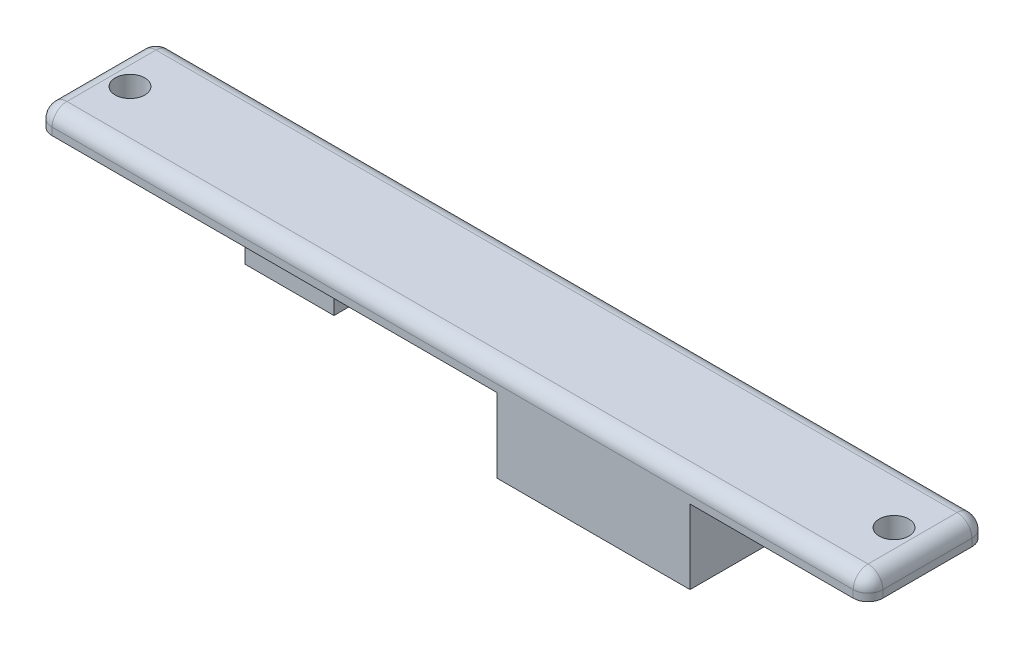
ISO-10303-21;
HEADER;
FILE_DESCRIPTION(('STEP AP214'),'2;1');
FILE_NAME('part.step','',(''),(''),'','','');
FILE_SCHEMA(('AUTOMOTIVE_DESIGN { 1 0 10303 214 1 1 1 1 }'));
ENDSEC;
DATA;
#1=APPLICATION_CONTEXT('core data for automotive mechanical design processes');
#2=APPLICATION_PROTOCOL_DEFINITION('international standard','automotive_design',2000,#1);
#3=PRODUCT_CONTEXT('',#1,'mechanical');
#4=PRODUCT('Part','Part','',(#3));
#5=PRODUCT_RELATED_PRODUCT_CATEGORY('part','',(#4));
#6=PRODUCT_DEFINITION_FORMATION('','',#4);
#7=PRODUCT_DEFINITION_CONTEXT('part definition',#1,'design');
#8=PRODUCT_DEFINITION('design','',#6,#7);
#9=PRODUCT_DEFINITION_SHAPE('','',#8);
#10=(LENGTH_UNIT() NAMED_UNIT(*) SI_UNIT(.MILLI.,.METRE.));
#11=(NAMED_UNIT(*) PLANE_ANGLE_UNIT() SI_UNIT($,.RADIAN.));
#12=(NAMED_UNIT(*) SI_UNIT($,.STERADIAN.) SOLID_ANGLE_UNIT());
#13=UNCERTAINTY_MEASURE_WITH_UNIT(LENGTH_MEASURE(1.E-05),#10,'distance_accuracy_value','');
#14=(GEOMETRIC_REPRESENTATION_CONTEXT(3) GLOBAL_UNCERTAINTY_ASSIGNED_CONTEXT((#13)) GLOBAL_UNIT_ASSIGNED_CONTEXT((#10,
#11,#12)) REPRESENTATION_CONTEXT('',''));
#15=CARTESIAN_POINT('',(0.,0.,0.));
#16=DIRECTION('',(0.,0.,1.));
#17=DIRECTION('',(1.,0.,0.));
#18=AXIS2_PLACEMENT_3D('',#15,#16,#17);
#19=CARTESIAN_POINT('',(0.,0.,0.));
#20=DIRECTION('',(0.,1.,0.));
#21=DIRECTION('',(0.,0.,1.));
#22=AXIS2_PLACEMENT_3D('',#19,#20,#21);
#23=PLANE('',#22);
#24=CARTESIAN_POINT('',(-25.75,0.,0.));
#25=DIRECTION('',(0.,1.,0.));
#26=DIRECTION('',(0.,0.,1.));
#27=AXIS2_PLACEMENT_3D('',#24,#25,#26);
#28=CIRCLE('',#27,1.);
#29=CARTESIAN_POINT('',(-25.75,0.,1.));
#30=VERTEX_POINT('',#29);
#31=EDGE_CURVE('E213',#30,#30,#28,.T.);
#32=ORIENTED_EDGE('',*,*,#31,.T.);
#33=EDGE_LOOP('',(#32));
#34=FACE_BOUND('',#33,.T.);
#35=DIRECTION('',(0.,0.,-1.));
#36=VECTOR('',#35,1.);
#37=CARTESIAN_POINT('',(-18.,0.,-4.));
#38=LINE('',#37,#36);
#39=CARTESIAN_POINT('',(-18.,0.,0.));
#40=VERTEX_POINT('',#39);
#41=CARTESIAN_POINT('',(-18.,0.,-4.));
#42=VERTEX_POINT('',#41);
#43=EDGE_CURVE('E50',#40,#42,#38,.T.);
#44=ORIENTED_EDGE('',*,*,#43,.F.);
#45=DIRECTION('',(-1.,0.,0.));
#46=VECTOR('',#45,1.);
#47=CARTESIAN_POINT('',(-18.,0.,0.));
#48=LINE('',#47,#46);
#49=CARTESIAN_POINT('',(-12.,0.,0.));
#50=VERTEX_POINT('',#49);
#51=EDGE_CURVE('E54',#50,#40,#48,.T.);
#52=ORIENTED_EDGE('',*,*,#51,.F.);
#53=DIRECTION('',(0.,0.,1.));
#54=VECTOR('',#53,1.);
#55=CARTESIAN_POINT('',(-12.,0.,-4.));
#56=LINE('',#55,#54);
#57=CARTESIAN_POINT('',(-12.,0.,-4.));
#58=VERTEX_POINT('',#57);
#59=EDGE_CURVE('E630',#58,#50,#56,.T.);
#60=ORIENTED_EDGE('',*,*,#59,.F.);
#61=DIRECTION('',(1.,0.,0.));
#62=VECTOR('',#61,1.);
#63=CARTESIAN_POINT('',(-28.,0.,-4.));
#64=LINE('',#63,#62);
#65=CARTESIAN_POINT('',(3.,0.,-4.));
#66=VERTEX_POINT('',#65);
#67=EDGE_CURVE('E239',#58,#66,#64,.T.);
#68=ORIENTED_EDGE('',*,*,#67,.T.);
#69=DIRECTION('',(0.,0.,-1.));
#70=VECTOR('',#69,1.);
#71=CARTESIAN_POINT('',(3.,0.,4.));
#72=LINE('',#71,#70);
#73=CARTESIAN_POINT('',(3.,0.,4.));
#74=VERTEX_POINT('',#73);
#75=EDGE_CURVE('E180',#74,#66,#72,.T.);
#76=ORIENTED_EDGE('',*,*,#75,.F.);
#77=DIRECTION('',(1.,0.,0.));
#78=VECTOR('',#77,1.);
#79=CARTESIAN_POINT('',(-28.,0.,4.));
#80=LINE('',#79,#78);
#81=CARTESIAN_POINT('',(-27.,0.,4.));
#82=VERTEX_POINT('',#81);
#83=EDGE_CURVE('E229',#82,#74,#80,.T.);
#84=ORIENTED_EDGE('',*,*,#83,.F.);
#85=CARTESIAN_POINT('',(-27.,0.,3.));
#86=DIRECTION('',(0.,1.,0.));
#87=DIRECTION('',(0.,0.,1.));
#88=AXIS2_PLACEMENT_3D('',#85,#86,#87);
#89=CIRCLE('',#88,1.);
#90=CARTESIAN_POINT('',(-28.,0.,3.));
#91=VERTEX_POINT('',#90);
#92=EDGE_CURVE('E276',#82,#91,#89,.F.);
#93=ORIENTED_EDGE('',*,*,#92,.T.);
#94=DIRECTION('',(0.,0.,1.));
#95=VECTOR('',#94,1.);
#96=CARTESIAN_POINT('',(-28.,0.,-4.));
#97=LINE('',#96,#95);
#98=CARTESIAN_POINT('',(-28.,0.,-3.));
#99=VERTEX_POINT('',#98);
#100=EDGE_CURVE('E225',#99,#91,#97,.T.);
#101=ORIENTED_EDGE('',*,*,#100,.F.);
#102=CARTESIAN_POINT('',(-27.,0.,-3.));
#103=DIRECTION('',(0.,1.,0.));
#104=DIRECTION('',(0.,0.,1.));
#105=AXIS2_PLACEMENT_3D('',#102,#103,#104);
#106=CIRCLE('',#105,1.);
#107=CARTESIAN_POINT('',(-27.,0.,-4.));
#108=VERTEX_POINT('',#107);
#109=EDGE_CURVE('E274',#99,#108,#106,.F.);
#110=ORIENTED_EDGE('',*,*,#109,.T.);
#111=EDGE_CURVE('E236',#108,#42,#64,.T.);
#112=ORIENTED_EDGE('',*,*,#111,.T.);
#113=EDGE_LOOP('',(#44,#52,#60,#68,#76,#84,#93,#101,#110,#112));
#114=FACE_BOUND('',#113,.T.);
#115=ADVANCED_FACE('F33',(#34,#114),#23,.F.);
#116=CARTESIAN_POINT('',(25.75,0.,0.));
#117=DIRECTION('',(0.,1.,0.));
#118=DIRECTION('',(0.,0.,1.));
#119=AXIS2_PLACEMENT_3D('',#116,#117,#118);
#120=CIRCLE('',#119,1.);
#121=CARTESIAN_POINT('',(25.75,0.,1.));
#122=VERTEX_POINT('',#121);
#123=EDGE_CURVE('E217',#122,#122,#120,.T.);
#124=ORIENTED_EDGE('',*,*,#123,.T.);
#125=EDGE_LOOP('',(#124));
#126=FACE_BOUND('',#125,.T.);
#127=DIRECTION('',(0.,0.,1.));
#128=VECTOR('',#127,1.);
#129=CARTESIAN_POINT('',(16.,0.,4.));
#130=LINE('',#129,#128);
#131=CARTESIAN_POINT('',(16.,0.,-4.));
#132=VERTEX_POINT('',#131);
#133=CARTESIAN_POINT('',(16.,0.,4.));
#134=VERTEX_POINT('',#133);
#135=EDGE_CURVE('E183',#132,#134,#130,.T.);
#136=ORIENTED_EDGE('',*,*,#135,.F.);
#137=CARTESIAN_POINT('',(27.,0.,-4.));
#138=VERTEX_POINT('',#137);
#139=EDGE_CURVE('E235',#132,#138,#64,.T.);
#140=ORIENTED_EDGE('',*,*,#139,.T.);
#141=CARTESIAN_POINT('',(27.,0.,-3.));
#142=DIRECTION('',(0.,1.,0.));
#143=DIRECTION('',(0.,0.,1.));
#144=AXIS2_PLACEMENT_3D('',#141,#142,#143);
#145=CIRCLE('',#144,1.);
#146=CARTESIAN_POINT('',(28.,0.,-3.));
#147=VERTEX_POINT('',#146);
#148=EDGE_CURVE('E11',#138,#147,#145,.F.);
#149=ORIENTED_EDGE('',*,*,#148,.T.);
#150=DIRECTION('',(0.,0.,1.));
#151=VECTOR('',#150,1.);
#152=CARTESIAN_POINT('',(28.,0.,-4.));
#153=LINE('',#152,#151);
#154=CARTESIAN_POINT('',(28.,0.,3.));
#155=VERTEX_POINT('',#154);
#156=EDGE_CURVE('E232',#147,#155,#153,.T.);
#157=ORIENTED_EDGE('',*,*,#156,.T.);
#158=CARTESIAN_POINT('',(27.,0.,3.));
#159=DIRECTION('',(0.,1.,0.));
#160=DIRECTION('',(0.,0.,1.));
#161=AXIS2_PLACEMENT_3D('',#158,#159,#160);
#162=CIRCLE('',#161,1.);
#163=CARTESIAN_POINT('',(27.,0.,4.));
#164=VERTEX_POINT('',#163);
#165=EDGE_CURVE('E42',#155,#164,#162,.F.);
#166=ORIENTED_EDGE('',*,*,#165,.T.);
#167=EDGE_CURVE('E228',#134,#164,#80,.T.);
#168=ORIENTED_EDGE('',*,*,#167,.F.);
#169=EDGE_LOOP('',(#136,#140,#149,#157,#166,#168));
#170=FACE_BOUND('',#169,.T.);
#171=ADVANCED_FACE('F345',(#126,#170),#23,.F.);
#172=CARTESIAN_POINT('',(-28.,1.5,-4.));
#173=DIRECTION('',(1.,0.,0.));
#174=DIRECTION('',(0.,0.,-1.));
#175=AXIS2_PLACEMENT_3D('',#172,#173,#174);
#176=PLANE('',#175);
#177=ORIENTED_EDGE('',*,*,#100,.T.);
#178=DIRECTION('',(0.,-1.,0.));
#179=VECTOR('',#178,1.);
#180=CARTESIAN_POINT('',(-28.,1.5,3.));
#181=LINE('',#180,#179);
#182=CARTESIAN_POINT('',(-28.,0.5,3.));
#183=VERTEX_POINT('',#182);
#184=EDGE_CURVE('E253',#91,#183,#181,.F.);
#185=ORIENTED_EDGE('',*,*,#184,.T.);
#186=DIRECTION('',(0.,0.,1.));
#187=VECTOR('',#186,1.);
#188=CARTESIAN_POINT('',(-28.,0.5,-4.));
#189=LINE('',#188,#187);
#190=CARTESIAN_POINT('',(-28.,0.5,-3.));
#191=VERTEX_POINT('',#190);
#192=EDGE_CURVE('E250',#183,#191,#189,.F.);
#193=ORIENTED_EDGE('',*,*,#192,.T.);
#194=DIRECTION('',(0.,-1.,0.));
#195=VECTOR('',#194,1.);
#196=CARTESIAN_POINT('',(-28.,0.,-3.));
#197=LINE('',#196,#195);
#198=EDGE_CURVE('E248',#191,#99,#197,.T.);
#199=ORIENTED_EDGE('',*,*,#198,.T.);
#200=EDGE_LOOP('',(#177,#185,#193,#199));
#201=FACE_BOUND('',#200,.T.);
#202=ADVANCED_FACE('F384',(#201),#176,.F.);
#203=CARTESIAN_POINT('',(-28.,1.5,4.));
#204=DIRECTION('',(0.,0.,-1.));
#205=DIRECTION('',(-1.,0.,0.));
#206=AXIS2_PLACEMENT_3D('',#203,#204,#205);
#207=PLANE('',#206);
#208=ORIENTED_EDGE('',*,*,#83,.T.);
#209=DIRECTION('',(0.,1.,0.));
#210=VECTOR('',#209,1.);
#211=CARTESIAN_POINT('',(3.,-5.,4.));
#212=LINE('',#211,#210);
#213=CARTESIAN_POINT('',(3.,-5.,4.));
#214=VERTEX_POINT('',#213);
#215=EDGE_CURVE('E197',#214,#74,#212,.T.);
#216=ORIENTED_EDGE('',*,*,#215,.F.);
#217=DIRECTION('',(-1.,0.,0.));
#218=VECTOR('',#217,1.);
#219=CARTESIAN_POINT('',(3.,-5.,4.));
#220=LINE('',#219,#218);
#221=CARTESIAN_POINT('',(16.,-5.,4.));
#222=VERTEX_POINT('',#221);
#223=EDGE_CURVE('E196',#222,#214,#220,.T.);
#224=ORIENTED_EDGE('',*,*,#223,.F.);
#225=DIRECTION('',(0.,1.,0.));
#226=VECTOR('',#225,1.);
#227=CARTESIAN_POINT('',(16.,-5.,4.));
#228=LINE('',#227,#226);
#229=EDGE_CURVE('E203',#222,#134,#228,.T.);
#230=ORIENTED_EDGE('',*,*,#229,.T.);
#231=ORIENTED_EDGE('',*,*,#167,.T.);
#232=DIRECTION('',(0.,-1.,0.));
#233=VECTOR('',#232,1.);
#234=CARTESIAN_POINT('',(27.,1.5,4.));
#235=LINE('',#234,#233);
#236=CARTESIAN_POINT('',(27.,0.5,4.));
#237=VERTEX_POINT('',#236);
#238=EDGE_CURVE('E272',#164,#237,#235,.F.);
#239=ORIENTED_EDGE('',*,*,#238,.T.);
#240=DIRECTION('',(1.,0.,0.));
#241=VECTOR('',#240,1.);
#242=CARTESIAN_POINT('',(-28.,0.5,4.));
#243=LINE('',#242,#241);
#244=CARTESIAN_POINT('',(-27.,0.5,4.));
#245=VERTEX_POINT('',#244);
#246=EDGE_CURVE('E270',#237,#245,#243,.F.);
#247=ORIENTED_EDGE('',*,*,#246,.T.);
#248=DIRECTION('',(0.,-1.,0.));
#249=VECTOR('',#248,1.);
#250=CARTESIAN_POINT('',(-27.,1.5,4.));
#251=LINE('',#250,#249);
#252=EDGE_CURVE('E268',#245,#82,#251,.T.);
#253=ORIENTED_EDGE('',*,*,#252,.T.);
#254=EDGE_LOOP('',(#208,#216,#224,#230,#231,#239,#247,#253));
#255=FACE_BOUND('',#254,.T.);
#256=ADVANCED_FACE('F393',(#255),#207,.F.);
#257=CARTESIAN_POINT('',(28.,1.5,-4.));
#258=DIRECTION('',(1.,0.,0.));
#259=DIRECTION('',(0.,0.,-1.));
#260=AXIS2_PLACEMENT_3D('',#257,#258,#259);
#261=PLANE('',#260);
#262=ORIENTED_EDGE('',*,*,#156,.F.);
#263=DIRECTION('',(0.,-1.,0.));
#264=VECTOR('',#263,1.);
#265=CARTESIAN_POINT('',(28.,1.5,-3.));
#266=LINE('',#265,#264);
#267=CARTESIAN_POINT('',(28.,0.5,-3.));
#268=VERTEX_POINT('',#267);
#269=EDGE_CURVE('E266',#147,#268,#266,.F.);
#270=ORIENTED_EDGE('',*,*,#269,.T.);
#271=DIRECTION('',(0.,0.,1.));
#272=VECTOR('',#271,1.);
#273=CARTESIAN_POINT('',(28.,0.5,-4.));
#274=LINE('',#273,#272);
#275=CARTESIAN_POINT('',(28.,0.5,3.));
#276=VERTEX_POINT('',#275);
#277=EDGE_CURVE('E264',#268,#276,#274,.T.);
#278=ORIENTED_EDGE('',*,*,#277,.T.);
#279=DIRECTION('',(0.,-1.,0.));
#280=VECTOR('',#279,1.);
#281=CARTESIAN_POINT('',(28.,0.,3.));
#282=LINE('',#281,#280);
#283=EDGE_CURVE('E262',#276,#155,#282,.T.);
#284=ORIENTED_EDGE('',*,*,#283,.T.);
#285=EDGE_LOOP('',(#262,#270,#278,#284));
#286=FACE_BOUND('',#285,.T.);
#287=ADVANCED_FACE('F337',(#286),#261,.T.);
#288=CARTESIAN_POINT('',(-28.,1.5,-4.));
#289=DIRECTION('',(0.,0.,-1.));
#290=DIRECTION('',(-1.,0.,0.));
#291=AXIS2_PLACEMENT_3D('',#288,#289,#290);
#292=PLANE('',#291);
#293=DIRECTION('',(1.,0.,0.));
#294=VECTOR('',#293,1.);
#295=CARTESIAN_POINT('',(-28.,0.5,-4.));
#296=LINE('',#295,#294);
#297=CARTESIAN_POINT('',(-27.,0.5,-4.));
#298=VERTEX_POINT('',#297);
#299=CARTESIAN_POINT('',(27.,0.5,-4.));
#300=VERTEX_POINT('',#299);
#301=EDGE_CURVE('E257',#298,#300,#296,.T.);
#302=ORIENTED_EDGE('',*,*,#301,.T.);
#303=DIRECTION('',(0.,-1.,0.));
#304=VECTOR('',#303,1.);
#305=CARTESIAN_POINT('',(27.,1.5,-4.));
#306=LINE('',#305,#304);
#307=EDGE_CURVE('E259',#300,#138,#306,.T.);
#308=ORIENTED_EDGE('',*,*,#307,.T.);
#309=ORIENTED_EDGE('',*,*,#139,.F.);
#310=DIRECTION('',(0.,1.,0.));
#311=VECTOR('',#310,1.);
#312=CARTESIAN_POINT('',(16.,-5.,-4.));
#313=LINE('',#312,#311);
#314=CARTESIAN_POINT('',(16.,-5.,-4.));
#315=VERTEX_POINT('',#314);
#316=EDGE_CURVE('E206',#315,#132,#313,.T.);
#317=ORIENTED_EDGE('',*,*,#316,.F.);
#318=DIRECTION('',(1.,0.,0.));
#319=VECTOR('',#318,1.);
#320=CARTESIAN_POINT('',(3.,-5.,-4.));
#321=LINE('',#320,#319);
#322=CARTESIAN_POINT('',(3.,-5.,-4.));
#323=VERTEX_POINT('',#322);
#324=EDGE_CURVE('E192',#323,#315,#321,.T.);
#325=ORIENTED_EDGE('',*,*,#324,.F.);
#326=DIRECTION('',(0.,1.,0.));
#327=VECTOR('',#326,1.);
#328=CARTESIAN_POINT('',(3.,-5.,-4.));
#329=LINE('',#328,#327);
#330=EDGE_CURVE('E209',#323,#66,#329,.T.);
#331=ORIENTED_EDGE('',*,*,#330,.T.);
#332=ORIENTED_EDGE('',*,*,#67,.F.);
#333=DIRECTION('',(0.,1.,0.));
#334=VECTOR('',#333,1.);
#335=CARTESIAN_POINT('',(-12.,-5.,-4.));
#336=LINE('',#335,#334);
#337=CARTESIAN_POINT('',(-12.,-5.,-4.));
#338=VERTEX_POINT('',#337);
#339=EDGE_CURVE('E165',#338,#58,#336,.T.);
#340=ORIENTED_EDGE('',*,*,#339,.F.);
#341=DIRECTION('',(1.,0.,0.));
#342=VECTOR('',#341,1.);
#343=CARTESIAN_POINT('',(-18.,-5.,-4.));
#344=LINE('',#343,#342);
#345=CARTESIAN_POINT('',(-18.,-5.,-4.));
#346=VERTEX_POINT('',#345);
#347=EDGE_CURVE('E158',#346,#338,#344,.T.);
#348=ORIENTED_EDGE('',*,*,#347,.F.);
#349=DIRECTION('',(0.,1.,0.));
#350=VECTOR('',#349,1.);
#351=CARTESIAN_POINT('',(-18.,-5.,-4.));
#352=LINE('',#351,#350);
#353=EDGE_CURVE('E163',#346,#42,#352,.T.);
#354=ORIENTED_EDGE('',*,*,#353,.T.);
#355=ORIENTED_EDGE('',*,*,#111,.F.);
#356=DIRECTION('',(0.,-1.,0.));
#357=VECTOR('',#356,1.);
#358=CARTESIAN_POINT('',(-27.,1.5,-4.));
#359=LINE('',#358,#357);
#360=EDGE_CURVE('E255',#108,#298,#359,.F.);
#361=ORIENTED_EDGE('',*,*,#360,.T.);
#362=EDGE_LOOP('',(#302,#308,#309,#317,#325,#331,#332,#340,#348,#354,#355,#361));
#363=FACE_BOUND('',#362,.T.);
#364=ADVANCED_FACE('F160',(#363),#292,.T.);
#365=CARTESIAN_POINT('',(0.,1.5,0.));
#366=DIRECTION('',(0.,1.,0.));
#367=DIRECTION('',(0.,0.,1.));
#368=AXIS2_PLACEMENT_3D('',#365,#366,#367);
#369=PLANE('',#368);
#370=DIRECTION('',(1.,0.,0.));
#371=VECTOR('',#370,1.);
#372=CARTESIAN_POINT('',(0.,1.5,-3.));
#373=LINE('',#372,#371);
#374=CARTESIAN_POINT('',(27.,1.5,-3.));
#375=VERTEX_POINT('',#374);
#376=CARTESIAN_POINT('',(-27.,1.5,-3.));
#377=VERTEX_POINT('',#376);
#378=EDGE_CURVE('E243',#375,#377,#373,.F.);
#379=ORIENTED_EDGE('',*,*,#378,.T.);
#380=DIRECTION('',(0.,0.,1.));
#381=VECTOR('',#380,1.);
#382=CARTESIAN_POINT('',(-27.,1.5,4.));
#383=LINE('',#382,#381);
#384=CARTESIAN_POINT('',(-27.,1.5,3.));
#385=VERTEX_POINT('',#384);
#386=EDGE_CURVE('E245',#377,#385,#383,.T.);
#387=ORIENTED_EDGE('',*,*,#386,.T.);
#388=DIRECTION('',(1.,0.,0.));
#389=VECTOR('',#388,1.);
#390=CARTESIAN_POINT('',(28.,1.5,3.));
#391=LINE('',#390,#389);
#392=CARTESIAN_POINT('',(27.,1.5,3.));
#393=VERTEX_POINT('',#392);
#394=EDGE_CURVE('E238',#385,#393,#391,.T.);
#395=ORIENTED_EDGE('',*,*,#394,.T.);
#396=DIRECTION('',(0.,0.,1.));
#397=VECTOR('',#396,1.);
#398=CARTESIAN_POINT('',(27.,1.5,0.));
#399=LINE('',#398,#397);
#400=EDGE_CURVE('E241',#393,#375,#399,.F.);
#401=ORIENTED_EDGE('',*,*,#400,.T.);
#402=EDGE_LOOP('',(#379,#387,#395,#401));
#403=FACE_BOUND('',#402,.T.);
#404=CARTESIAN_POINT('',(-25.75,1.5,0.));
#405=DIRECTION('',(0.,1.,0.));
#406=DIRECTION('',(0.,0.,1.));
#407=AXIS2_PLACEMENT_3D('',#404,#405,#406);
#408=CIRCLE('',#407,1.);
#409=CARTESIAN_POINT('',(-25.75,1.5,1.));
#410=VERTEX_POINT('',#409);
#411=EDGE_CURVE('E222',#410,#410,#408,.T.);
#412=ORIENTED_EDGE('',*,*,#411,.F.);
#413=EDGE_LOOP('',(#412));
#414=FACE_BOUND('',#413,.T.);
#415=CARTESIAN_POINT('',(25.75,1.5,0.));
#416=DIRECTION('',(0.,1.,0.));
#417=DIRECTION('',(0.,0.,1.));
#418=AXIS2_PLACEMENT_3D('',#415,#416,#417);
#419=CIRCLE('',#418,1.);
#420=CARTESIAN_POINT('',(25.75,1.5,1.));
#421=VERTEX_POINT('',#420);
#422=EDGE_CURVE('E216',#421,#421,#419,.T.);
#423=ORIENTED_EDGE('',*,*,#422,.F.);
#424=EDGE_LOOP('',(#423));
#425=FACE_BOUND('',#424,.T.);
#426=ADVANCED_FACE('F325',(#403,#414,#425),#369,.T.);
#427=CARTESIAN_POINT('',(25.75,0.,0.));
#428=DIRECTION('',(0.,1.,0.));
#429=DIRECTION('',(0.,0.,1.));
#430=AXIS2_PLACEMENT_3D('',#427,#428,#429);
#431=CYLINDRICAL_SURFACE('',#430,1.);
#432=ORIENTED_EDGE('',*,*,#422,.T.);
#433=EDGE_LOOP('',(#432));
#434=FACE_BOUND('',#433,.T.);
#435=ORIENTED_EDGE('',*,*,#123,.F.);
#436=EDGE_LOOP('',(#435));
#437=FACE_BOUND('',#436,.T.);
#438=ADVANCED_FACE('F551',(#434,#437),#431,.F.);
#439=CARTESIAN_POINT('',(-25.75,0.,0.));
#440=DIRECTION('',(0.,1.,0.));
#441=DIRECTION('',(0.,0.,1.));
#442=AXIS2_PLACEMENT_3D('',#439,#440,#441);
#443=CYLINDRICAL_SURFACE('',#442,1.);
#444=ORIENTED_EDGE('',*,*,#411,.T.);
#445=EDGE_LOOP('',(#444));
#446=FACE_BOUND('',#445,.T.);
#447=ORIENTED_EDGE('',*,*,#31,.F.);
#448=EDGE_LOOP('',(#447));
#449=FACE_BOUND('',#448,.T.);
#450=ADVANCED_FACE('F561',(#446,#449),#443,.F.);
#451=CARTESIAN_POINT('',(27.,1.5,-3.));
#452=DIRECTION('',(0.,-1.,0.));
#453=DIRECTION('',(0.,0.,-1.));
#454=AXIS2_PLACEMENT_3D('',#451,#452,#453);
#455=CYLINDRICAL_SURFACE('',#454,1.);
#456=ORIENTED_EDGE('',*,*,#148,.F.);
#457=ORIENTED_EDGE('',*,*,#307,.F.);
#458=CARTESIAN_POINT('',(27.,0.5,-3.));
#459=DIRECTION('',(0.,1.,0.));
#460=DIRECTION('',(0.,0.,1.));
#461=AXIS2_PLACEMENT_3D('',#458,#459,#460);
#462=CIRCLE('',#461,1.);
#463=EDGE_CURVE('E37',#268,#300,#462,.T.);
#464=ORIENTED_EDGE('',*,*,#463,.F.);
#465=ORIENTED_EDGE('',*,*,#269,.F.);
#466=EDGE_LOOP('',(#456,#457,#464,#465));
#467=FACE_BOUND('',#466,.T.);
#468=ADVANCED_FACE('F35',(#467),#455,.T.);
#469=CARTESIAN_POINT('',(27.,0.5,-4.));
#470=DIRECTION('',(0.,0.,1.));
#471=DIRECTION('',(1.,0.,0.));
#472=AXIS2_PLACEMENT_3D('',#469,#470,#471);
#473=CYLINDRICAL_SURFACE('',#472,1.);
#474=CARTESIAN_POINT('',(27.,0.5,3.));
#475=DIRECTION('',(0.,0.,1.));
#476=DIRECTION('',(1.,0.,0.));
#477=AXIS2_PLACEMENT_3D('',#474,#475,#476);
#478=CIRCLE('',#477,1.);
#479=EDGE_CURVE('E304',#276,#393,#478,.T.);
#480=ORIENTED_EDGE('',*,*,#479,.F.);
#481=ORIENTED_EDGE('',*,*,#277,.F.);
#482=CARTESIAN_POINT('',(27.,0.5,-3.));
#483=DIRECTION('',(0.,0.,-1.));
#484=DIRECTION('',(-1.,0.,0.));
#485=AXIS2_PLACEMENT_3D('',#482,#483,#484);
#486=CIRCLE('',#485,1.);
#487=EDGE_CURVE('E306',#375,#268,#486,.T.);
#488=ORIENTED_EDGE('',*,*,#487,.F.);
#489=ORIENTED_EDGE('',*,*,#400,.F.);
#490=EDGE_LOOP('',(#480,#481,#488,#489));
#491=FACE_BOUND('',#490,.T.);
#492=ADVANCED_FACE('F333',(#491),#473,.T.);
#493=CARTESIAN_POINT('',(27.,1.5,3.));
#494=DIRECTION('',(0.,1.,0.));
#495=DIRECTION('',(0.,0.,1.));
#496=AXIS2_PLACEMENT_3D('',#493,#494,#495);
#497=CYLINDRICAL_SURFACE('',#496,1.);
#498=ORIENTED_EDGE('',*,*,#165,.F.);
#499=ORIENTED_EDGE('',*,*,#283,.F.);
#500=CARTESIAN_POINT('',(27.,0.5,3.));
#501=DIRECTION('',(0.,1.,0.));
#502=DIRECTION('',(0.,0.,1.));
#503=AXIS2_PLACEMENT_3D('',#500,#501,#502);
#504=CIRCLE('',#503,1.);
#505=EDGE_CURVE('E301',#237,#276,#504,.T.);
#506=ORIENTED_EDGE('',*,*,#505,.F.);
#507=ORIENTED_EDGE('',*,*,#238,.F.);
#508=EDGE_LOOP('',(#498,#499,#506,#507));
#509=FACE_BOUND('',#508,.T.);
#510=ADVANCED_FACE('F341',(#509),#497,.T.);
#511=CARTESIAN_POINT('',(27.,0.5,-3.));
#512=DIRECTION('',(0.,0.,1.));
#513=DIRECTION('',(1.,0.,0.));
#514=AXIS2_PLACEMENT_3D('',#511,#512,#513);
#515=SPHERICAL_SURFACE('',#514,1.);
#516=ORIENTED_EDGE('',*,*,#487,.T.);
#517=ORIENTED_EDGE('',*,*,#463,.T.);
#518=CARTESIAN_POINT('',(27.,0.5,-3.));
#519=DIRECTION('',(1.,0.,0.));
#520=DIRECTION('',(0.,0.,-1.));
#521=AXIS2_PLACEMENT_3D('',#518,#519,#520);
#522=CIRCLE('',#521,1.);
#523=EDGE_CURVE('E298',#375,#300,#522,.F.);
#524=ORIENTED_EDGE('',*,*,#523,.F.);
#525=EDGE_LOOP('',(#516,#517,#524));
#526=FACE_BOUND('',#525,.T.);
#527=ADVANCED_FACE('F313',(#526),#515,.T.);
#528=CARTESIAN_POINT('',(27.,0.5,3.));
#529=DIRECTION('',(0.,0.,1.));
#530=DIRECTION('',(1.,0.,0.));
#531=AXIS2_PLACEMENT_3D('',#528,#529,#530);
#532=SPHERICAL_SURFACE('',#531,1.);
#533=ORIENTED_EDGE('',*,*,#505,.T.);
#534=ORIENTED_EDGE('',*,*,#479,.T.);
#535=CARTESIAN_POINT('',(27.,0.5,3.));
#536=DIRECTION('',(1.,0.,0.));
#537=DIRECTION('',(0.,0.,-1.));
#538=AXIS2_PLACEMENT_3D('',#535,#536,#537);
#539=CIRCLE('',#538,1.);
#540=EDGE_CURVE('E295',#237,#393,#539,.F.);
#541=ORIENTED_EDGE('',*,*,#540,.F.);
#542=EDGE_LOOP('',(#533,#534,#541));
#543=FACE_BOUND('',#542,.T.);
#544=ADVANCED_FACE('F368',(#543),#532,.T.);
#545=CARTESIAN_POINT('',(-27.,1.5,-3.));
#546=DIRECTION('',(0.,1.,0.));
#547=DIRECTION('',(0.,0.,1.));
#548=AXIS2_PLACEMENT_3D('',#545,#546,#547);
#549=CYLINDRICAL_SURFACE('',#548,1.);
#550=ORIENTED_EDGE('',*,*,#109,.F.);
#551=ORIENTED_EDGE('',*,*,#198,.F.);
#552=CARTESIAN_POINT('',(-27.,0.5,-3.));
#553=DIRECTION('',(0.,1.,0.));
#554=DIRECTION('',(0.,0.,1.));
#555=AXIS2_PLACEMENT_3D('',#552,#553,#554);
#556=CIRCLE('',#555,1.);
#557=EDGE_CURVE('E292',#298,#191,#556,.T.);
#558=ORIENTED_EDGE('',*,*,#557,.F.);
#559=ORIENTED_EDGE('',*,*,#360,.F.);
#560=EDGE_LOOP('',(#550,#551,#558,#559));
#561=FACE_BOUND('',#560,.T.);
#562=ADVANCED_FACE('F352',(#561),#549,.T.);
#563=CARTESIAN_POINT('',(-28.,0.5,-3.));
#564=DIRECTION('',(1.,0.,0.));
#565=DIRECTION('',(0.,0.,-1.));
#566=AXIS2_PLACEMENT_3D('',#563,#564,#565);
#567=CYLINDRICAL_SURFACE('',#566,1.);
#568=ORIENTED_EDGE('',*,*,#523,.T.);
#569=ORIENTED_EDGE('',*,*,#301,.F.);
#570=CARTESIAN_POINT('',(-27.,0.5,-3.));
#571=DIRECTION('',(-1.,0.,0.));
#572=DIRECTION('',(0.,0.,1.));
#573=AXIS2_PLACEMENT_3D('',#570,#571,#572);
#574=CIRCLE('',#573,1.);
#575=EDGE_CURVE('E289',#377,#298,#574,.T.);
#576=ORIENTED_EDGE('',*,*,#575,.F.);
#577=ORIENTED_EDGE('',*,*,#378,.F.);
#578=EDGE_LOOP('',(#568,#569,#576,#577));
#579=FACE_BOUND('',#578,.T.);
#580=ADVANCED_FACE('F320',(#579),#567,.T.);
#581=CARTESIAN_POINT('',(0.,0.5,3.));
#582=DIRECTION('',(-1.,0.,0.));
#583=DIRECTION('',(0.,0.,1.));
#584=AXIS2_PLACEMENT_3D('',#581,#582,#583);
#585=CYLINDRICAL_SURFACE('',#584,1.);
#586=ORIENTED_EDGE('',*,*,#540,.T.);
#587=ORIENTED_EDGE('',*,*,#394,.F.);
#588=CARTESIAN_POINT('',(-27.,0.5,3.));
#589=DIRECTION('',(-1.,0.,0.));
#590=DIRECTION('',(0.,-1.,0.));
#591=AXIS2_PLACEMENT_3D('',#588,#589,#590);
#592=CIRCLE('',#591,1.);
#593=EDGE_CURVE('E286',#245,#385,#592,.T.);
#594=ORIENTED_EDGE('',*,*,#593,.F.);
#595=ORIENTED_EDGE('',*,*,#246,.F.);
#596=EDGE_LOOP('',(#586,#587,#594,#595));
#597=FACE_BOUND('',#596,.T.);
#598=ADVANCED_FACE('F366',(#597),#585,.T.);
#599=CARTESIAN_POINT('',(-27.,1.5,3.));
#600=DIRECTION('',(0.,-1.,0.));
#601=DIRECTION('',(0.,0.,-1.));
#602=AXIS2_PLACEMENT_3D('',#599,#600,#601);
#603=CYLINDRICAL_SURFACE('',#602,1.);
#604=ORIENTED_EDGE('',*,*,#92,.F.);
#605=ORIENTED_EDGE('',*,*,#252,.F.);
#606=CARTESIAN_POINT('',(-27.,0.5,3.));
#607=DIRECTION('',(0.,1.,0.));
#608=DIRECTION('',(0.,0.,1.));
#609=AXIS2_PLACEMENT_3D('',#606,#607,#608);
#610=CIRCLE('',#609,1.);
#611=EDGE_CURVE('E283',#183,#245,#610,.T.);
#612=ORIENTED_EDGE('',*,*,#611,.F.);
#613=ORIENTED_EDGE('',*,*,#184,.F.);
#614=EDGE_LOOP('',(#604,#605,#612,#613));
#615=FACE_BOUND('',#614,.T.);
#616=ADVANCED_FACE('F407',(#615),#603,.T.);
#617=CARTESIAN_POINT('',(-27.,0.5,-3.));
#618=DIRECTION('',(0.,0.,1.));
#619=DIRECTION('',(1.,0.,0.));
#620=AXIS2_PLACEMENT_3D('',#617,#618,#619);
#621=SPHERICAL_SURFACE('',#620,1.);
#622=ORIENTED_EDGE('',*,*,#575,.T.);
#623=ORIENTED_EDGE('',*,*,#557,.T.);
#624=CARTESIAN_POINT('',(-27.,0.5,-3.));
#625=DIRECTION('',(0.,0.,-1.));
#626=DIRECTION('',(-1.,0.,0.));
#627=AXIS2_PLACEMENT_3D('',#624,#625,#626);
#628=CIRCLE('',#627,1.);
#629=EDGE_CURVE('E281',#377,#191,#628,.F.);
#630=ORIENTED_EDGE('',*,*,#629,.F.);
#631=EDGE_LOOP('',(#622,#623,#630));
#632=FACE_BOUND('',#631,.T.);
#633=ADVANCED_FACE('F355',(#632),#621,.T.);
#634=CARTESIAN_POINT('',(-27.,0.5,3.));
#635=DIRECTION('',(0.,0.,1.));
#636=DIRECTION('',(1.,0.,0.));
#637=AXIS2_PLACEMENT_3D('',#634,#635,#636);
#638=SPHERICAL_SURFACE('',#637,1.);
#639=ORIENTED_EDGE('',*,*,#611,.T.);
#640=ORIENTED_EDGE('',*,*,#593,.T.);
#641=CARTESIAN_POINT('',(-27.,0.5,3.));
#642=DIRECTION('',(0.,0.,1.));
#643=DIRECTION('',(1.,0.,0.));
#644=AXIS2_PLACEMENT_3D('',#641,#642,#643);
#645=CIRCLE('',#644,1.);
#646=EDGE_CURVE('E212',#183,#385,#645,.F.);
#647=ORIENTED_EDGE('',*,*,#646,.F.);
#648=EDGE_LOOP('',(#639,#640,#647));
#649=FACE_BOUND('',#648,.T.);
#650=ADVANCED_FACE('F362',(#649),#638,.T.);
#651=CARTESIAN_POINT('',(-27.,0.5,0.));
#652=DIRECTION('',(0.,0.,-1.));
#653=DIRECTION('',(-1.,0.,0.));
#654=AXIS2_PLACEMENT_3D('',#651,#652,#653);
#655=CYLINDRICAL_SURFACE('',#654,1.);
#656=ORIENTED_EDGE('',*,*,#629,.T.);
#657=ORIENTED_EDGE('',*,*,#192,.F.);
#658=ORIENTED_EDGE('',*,*,#646,.T.);
#659=ORIENTED_EDGE('',*,*,#386,.F.);
#660=EDGE_LOOP('',(#656,#657,#658,#659));
#661=FACE_BOUND('',#660,.T.);
#662=ADVANCED_FACE('F358',(#661),#655,.T.);
#663=CARTESIAN_POINT('',(3.,-5.,4.));
#664=DIRECTION('',(1.,0.,0.));
#665=DIRECTION('',(0.,0.,-1.));
#666=AXIS2_PLACEMENT_3D('',#663,#664,#665);
#667=PLANE('',#666);
#668=ORIENTED_EDGE('',*,*,#75,.T.);
#669=ORIENTED_EDGE('',*,*,#330,.F.);
#670=DIRECTION('',(0.,0.,-1.));
#671=VECTOR('',#670,1.);
#672=CARTESIAN_POINT('',(3.,-5.,4.));
#673=LINE('',#672,#671);
#674=EDGE_CURVE('E189',#214,#323,#673,.T.);
#675=ORIENTED_EDGE('',*,*,#674,.F.);
#676=ORIENTED_EDGE('',*,*,#215,.T.);
#677=EDGE_LOOP('',(#668,#669,#675,#676));
#678=FACE_BOUND('',#677,.T.);
#679=ADVANCED_FACE('F402',(#678),#667,.F.);
#680=CARTESIAN_POINT('',(16.,-5.,4.));
#681=DIRECTION('',(-1.,0.,0.));
#682=DIRECTION('',(0.,0.,1.));
#683=AXIS2_PLACEMENT_3D('',#680,#681,#682);
#684=PLANE('',#683);
#685=ORIENTED_EDGE('',*,*,#135,.T.);
#686=ORIENTED_EDGE('',*,*,#229,.F.);
#687=DIRECTION('',(0.,0.,1.));
#688=VECTOR('',#687,1.);
#689=CARTESIAN_POINT('',(16.,-5.,4.));
#690=LINE('',#689,#688);
#691=EDGE_CURVE('E194',#315,#222,#690,.T.);
#692=ORIENTED_EDGE('',*,*,#691,.F.);
#693=ORIENTED_EDGE('',*,*,#316,.T.);
#694=EDGE_LOOP('',(#685,#686,#692,#693));
#695=FACE_BOUND('',#694,.T.);
#696=ADVANCED_FACE('F460',(#695),#684,.F.);
#697=CARTESIAN_POINT('',(0.,-5.,0.));
#698=DIRECTION('',(0.,-1.,0.));
#699=DIRECTION('',(0.,0.,-1.));
#700=AXIS2_PLACEMENT_3D('',#697,#698,#699);
#701=PLANE('',#700);
#702=ORIENTED_EDGE('',*,*,#674,.T.);
#703=ORIENTED_EDGE('',*,*,#324,.T.);
#704=ORIENTED_EDGE('',*,*,#691,.T.);
#705=ORIENTED_EDGE('',*,*,#223,.T.);
#706=EDGE_LOOP('',(#702,#703,#704,#705));
#707=FACE_BOUND('',#706,.T.);
#708=ADVANCED_FACE('F468',(#707),#701,.T.);
#709=CARTESIAN_POINT('',(-18.,-5.,-4.));
#710=DIRECTION('',(1.,0.,0.));
#711=DIRECTION('',(0.,0.,-1.));
#712=AXIS2_PLACEMENT_3D('',#709,#710,#711);
#713=PLANE('',#712);
#714=ORIENTED_EDGE('',*,*,#43,.T.);
#715=ORIENTED_EDGE('',*,*,#353,.F.);
#716=DIRECTION('',(0.,0.,-1.));
#717=VECTOR('',#716,1.);
#718=CARTESIAN_POINT('',(-18.,-5.,-4.));
#719=LINE('',#718,#717);
#720=CARTESIAN_POINT('',(-18.,-5.,0.));
#721=VERTEX_POINT('',#720);
#722=EDGE_CURVE('E169',#721,#346,#719,.T.);
#723=ORIENTED_EDGE('',*,*,#722,.F.);
#724=DIRECTION('',(0.,1.,0.));
#725=VECTOR('',#724,1.);
#726=CARTESIAN_POINT('',(-18.,-5.,0.));
#727=LINE('',#726,#725);
#728=EDGE_CURVE('E628',#721,#40,#727,.T.);
#729=ORIENTED_EDGE('',*,*,#728,.T.);
#730=EDGE_LOOP('',(#714,#715,#723,#729));
#731=FACE_BOUND('',#730,.T.);
#732=ADVANCED_FACE('F179',(#731),#713,.F.);
#733=CARTESIAN_POINT('',(-12.,-5.,-4.));
#734=DIRECTION('',(-1.,0.,0.));
#735=DIRECTION('',(0.,0.,1.));
#736=AXIS2_PLACEMENT_3D('',#733,#734,#735);
#737=PLANE('',#736);
#738=ORIENTED_EDGE('',*,*,#59,.T.);
#739=DIRECTION('',(0.,1.,0.));
#740=VECTOR('',#739,1.);
#741=CARTESIAN_POINT('',(-12.,-5.,0.));
#742=LINE('',#741,#740);
#743=CARTESIAN_POINT('',(-12.,-5.,0.));
#744=VERTEX_POINT('',#743);
#745=EDGE_CURVE('E185',#744,#50,#742,.T.);
#746=ORIENTED_EDGE('',*,*,#745,.F.);
#747=DIRECTION('',(0.,0.,1.));
#748=VECTOR('',#747,1.);
#749=CARTESIAN_POINT('',(-12.,-5.,-4.));
#750=LINE('',#749,#748);
#751=EDGE_CURVE('E168',#338,#744,#750,.T.);
#752=ORIENTED_EDGE('',*,*,#751,.F.);
#753=ORIENTED_EDGE('',*,*,#339,.T.);
#754=EDGE_LOOP('',(#738,#746,#752,#753));
#755=FACE_BOUND('',#754,.T.);
#756=ADVANCED_FACE('F483',(#755),#737,.F.);
#757=CARTESIAN_POINT('',(-18.,-5.,0.));
#758=DIRECTION('',(0.,0.,-1.));
#759=DIRECTION('',(-1.,0.,0.));
#760=AXIS2_PLACEMENT_3D('',#757,#758,#759);
#761=PLANE('',#760);
#762=ORIENTED_EDGE('',*,*,#51,.T.);
#763=ORIENTED_EDGE('',*,*,#728,.F.);
#764=DIRECTION('',(-1.,0.,0.));
#765=VECTOR('',#764,1.);
#766=CARTESIAN_POINT('',(-18.,-5.,0.));
#767=LINE('',#766,#765);
#768=EDGE_CURVE('E174',#744,#721,#767,.T.);
#769=ORIENTED_EDGE('',*,*,#768,.F.);
#770=ORIENTED_EDGE('',*,*,#745,.T.);
#771=EDGE_LOOP('',(#762,#763,#769,#770));
#772=FACE_BOUND('',#771,.T.);
#773=ADVANCED_FACE('F490',(#772),#761,.F.);
#774=CARTESIAN_POINT('',(0.,-5.,0.));
#775=DIRECTION('',(0.,1.,0.));
#776=DIRECTION('',(0.,0.,1.));
#777=AXIS2_PLACEMENT_3D('',#774,#775,#776);
#778=PLANE('',#777);
#779=ORIENTED_EDGE('',*,*,#722,.T.);
#780=ORIENTED_EDGE('',*,*,#347,.T.);
#781=ORIENTED_EDGE('',*,*,#751,.T.);
#782=ORIENTED_EDGE('',*,*,#768,.T.);
#783=EDGE_LOOP('',(#779,#780,#781,#782));
#784=FACE_BOUND('',#783,.T.);
#785=ADVANCED_FACE('F172',(#784),#778,.F.);
#786=CLOSED_SHELL('',(#115,#171,#202,#256,#287,#364,#426,#438,#450,#468,#492,#510,#527,#544,
#562,#580,#598,#616,#633,#650,#662,#679,#696,#708,#732,#756,#773,#785));
#787=MANIFOLD_SOLID_BREP('B2',#786);
#788=ADVANCED_BREP_SHAPE_REPRESENTATION('',(#18,#787),#14);
#789=SHAPE_DEFINITION_REPRESENTATION(#9,#788);
ENDSEC;
END-ISO-10303-21;
